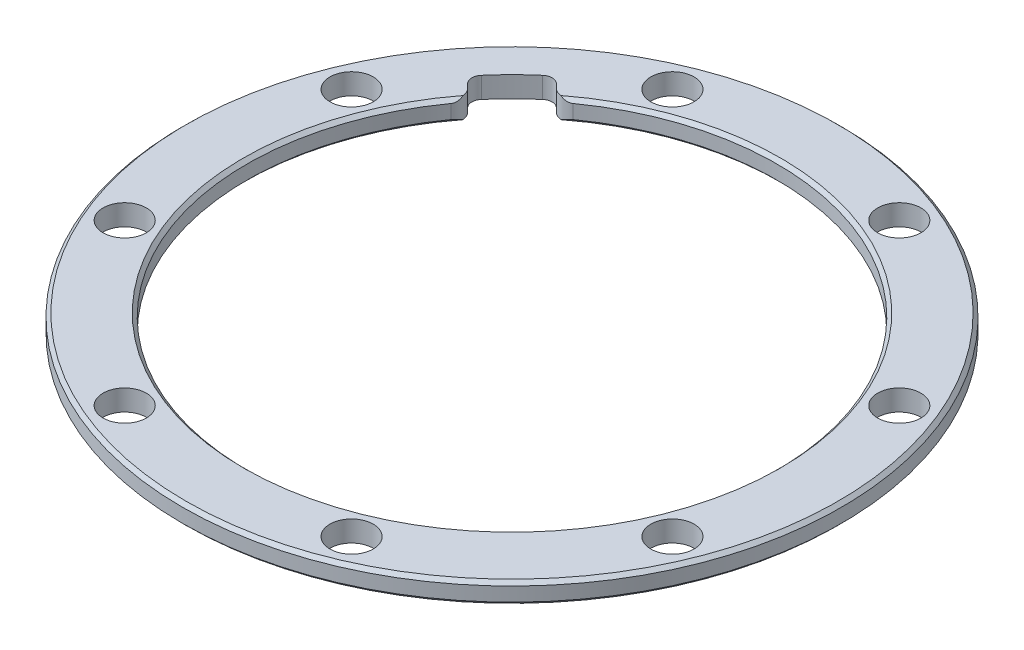
ISO-10303-21;
HEADER;
FILE_DESCRIPTION(('STEP AP214'),'2;1');
FILE_NAME('part.step','',(''),(''),'','','');
FILE_SCHEMA(('AUTOMOTIVE_DESIGN { 1 0 10303 214 1 1 1 1 }'));
ENDSEC;
DATA;
#1=APPLICATION_CONTEXT('core data for automotive mechanical design processes');
#2=APPLICATION_PROTOCOL_DEFINITION('international standard','automotive_design',2000,#1);
#3=PRODUCT_CONTEXT('',#1,'mechanical');
#4=PRODUCT('Part','Part','',(#3));
#5=PRODUCT_RELATED_PRODUCT_CATEGORY('part','',(#4));
#6=PRODUCT_DEFINITION_FORMATION('','',#4);
#7=PRODUCT_DEFINITION_CONTEXT('part definition',#1,'design');
#8=PRODUCT_DEFINITION('design','',#6,#7);
#9=PRODUCT_DEFINITION_SHAPE('','',#8);
#10=(LENGTH_UNIT() NAMED_UNIT(*) SI_UNIT(.MILLI.,.METRE.));
#11=(NAMED_UNIT(*) PLANE_ANGLE_UNIT() SI_UNIT($,.RADIAN.));
#12=(NAMED_UNIT(*) SI_UNIT($,.STERADIAN.) SOLID_ANGLE_UNIT());
#13=UNCERTAINTY_MEASURE_WITH_UNIT(LENGTH_MEASURE(1.E-05),#10,'distance_accuracy_value','');
#14=(GEOMETRIC_REPRESENTATION_CONTEXT(3) GLOBAL_UNCERTAINTY_ASSIGNED_CONTEXT((#13)) GLOBAL_UNIT_ASSIGNED_CONTEXT((#10,
#11,#12)) REPRESENTATION_CONTEXT('',''));
#15=CARTESIAN_POINT('',(0.,0.,0.));
#16=DIRECTION('',(0.,0.,1.));
#17=DIRECTION('',(1.,0.,0.));
#18=AXIS2_PLACEMENT_3D('',#15,#16,#17);
#19=CARTESIAN_POINT('',(0.,3.,0.));
#20=DIRECTION('',(0.,1.,0.));
#21=DIRECTION('',(0.,0.,1.));
#22=AXIS2_PLACEMENT_3D('',#19,#20,#21);
#23=PLANE('',#22);
#24=DIRECTION('',(0.70710364020529,0.,0.707109922153853));
#25=VECTOR('',#24,1.);
#26=CARTESIAN_POINT('',(-23.1447817429344,3.,-29.508976662052));
#27=LINE('',#26,#25);
#28=CARTESIAN_POINT('',(-25.2690481357726,3.,-31.6332619269925));
#29=VERTEX_POINT('',#28);
#30=CARTESIAN_POINT('',(-24.7262134702033,3.,-31.0904224388494));
#31=VERTEX_POINT('',#30);
#32=EDGE_CURVE('E127',#29,#31,#27,.T.);
#33=ORIENTED_EDGE('',*,*,#32,.T.);
#34=CARTESIAN_POINT('',(-23.3119936258956,3.,-32.50462971926));
#35=DIRECTION('',(0.,1.,0.));
#36=DIRECTION('',(0.,0.,1.));
#37=AXIS2_PLACEMENT_3D('',#34,#35,#36);
#38=CIRCLE('',#37,2.);
#39=CARTESIAN_POINT('',(-23.4795362384635,3.,-30.5116597061956));
#40=VERTEX_POINT('',#39);
#41=EDGE_CURVE('E242',#31,#40,#38,.T.);
#42=ORIENTED_EDGE('',*,*,#41,.T.);
#43=CARTESIAN_POINT('',(0.,3.,0.));
#44=DIRECTION('',(0.,1.,0.));
#45=DIRECTION('',(0.,0.,1.));
#46=AXIS2_PLACEMENT_3D('',#43,#44,#45);
#47=CIRCLE('',#46,38.5);
#48=CARTESIAN_POINT('',(-30.5116593053988,3.,-23.479536759299));
#49=VERTEX_POINT('',#48);
#50=EDGE_CURVE('E218',#40,#49,#47,.F.);
#51=ORIENTED_EDGE('',*,*,#50,.T.);
#52=CARTESIAN_POINT('',(-32.5046293213233,3.,-23.3119941807511));
#53=DIRECTION('',(0.,1.,0.));
#54=DIRECTION('',(0.,0.,1.));
#55=AXIS2_PLACEMENT_3D('',#52,#53,#54);
#56=CIRCLE('',#55,2.);
#57=CARTESIAN_POINT('',(-31.0904220167719,3.,-24.7262140009182));
#58=VERTEX_POINT('',#57);
#59=EDGE_CURVE('E125',#49,#58,#56,.T.);
#60=ORIENTED_EDGE('',*,*,#59,.T.);
#61=DIRECTION('',(-0.70710991008356,0.,-0.70710365227569));
#62=VECTOR('',#61,1.);
#63=CARTESIAN_POINT('',(-31.6332614956487,3.,-25.2690486757538));
#64=LINE('',#63,#62);
#65=CARTESIAN_POINT('',(-31.6332614956487,3.,-25.2690486757538));
#66=VERTEX_POINT('',#65);
#67=EDGE_CURVE('E116',#58,#66,#64,.T.);
#68=ORIENTED_EDGE('',*,*,#67,.T.);
#69=CARTESIAN_POINT('',(-30.5726060172352,3.,-26.3297135408791));
#70=DIRECTION('',(0.,-1.,0.));
#71=DIRECTION('',(0.,0.,1.));
#72=AXIS2_PLACEMENT_3D('',#69,#70,#71);
#73=CIRCLE('',#72,1.5);
#74=CARTESIAN_POINT('',(-31.709198504734,3.,-27.3085687484361));
#75=VERTEX_POINT('',#74);
#76=EDGE_CURVE('E122',#66,#75,#73,.T.);
#77=ORIENTED_EDGE('',*,*,#76,.T.);
#78=CARTESIAN_POINT('',(0.,3.,0.));
#79=DIRECTION('',(0.,-1.,0.));
#80=DIRECTION('',(0.,0.,-1.));
#81=AXIS2_PLACEMENT_3D('',#78,#79,#80);
#82=CIRCLE('',#81,41.8477143569477);
#83=CARTESIAN_POINT('',(-27.3085682071587,3.,-31.7091989708924));
#84=VERTEX_POINT('',#83);
#85=EDGE_CURVE('E142',#75,#84,#82,.T.);
#86=ORIENTED_EDGE('',*,*,#85,.T.);
#87=CARTESIAN_POINT('',(-26.3297130190034,3.,-30.5726064666845));
#88=DIRECTION('',(0.,-1.,0.));
#89=DIRECTION('',(0.,0.,-1.));
#90=AXIS2_PLACEMENT_3D('',#87,#88,#89);
#91=CIRCLE('',#90,1.5);
#92=EDGE_CURVE('E137',#84,#29,#91,.T.);
#93=ORIENTED_EDGE('',*,*,#92,.T.);
#94=EDGE_LOOP('',(#33,#42,#51,#60,#68,#77,#86,#93));
#95=FACE_BOUND('',#94,.T.);
#96=CARTESIAN_POINT('',(0.,3.,0.));
#97=DIRECTION('',(0.,1.,0.));
#98=DIRECTION('',(0.,0.,1.));
#99=AXIS2_PLACEMENT_3D('',#96,#97,#98);
#100=CIRCLE('',#99,46.75);
#101=CARTESIAN_POINT('',(0.,3.,46.75));
#102=VERTEX_POINT('',#101);
#103=EDGE_CURVE('E215',#102,#102,#100,.T.);
#104=ORIENTED_EDGE('',*,*,#103,.T.);
#105=EDGE_LOOP('',(#104));
#106=FACE_BOUND('',#105,.T.);
#107=CARTESIAN_POINT('',(-39.2648801317297,3.,16.2640458755163));
#108=DIRECTION('',(0.,1.,0.));
#109=DIRECTION('',(0.,0.,1.));
#110=AXIS2_PLACEMENT_3D('',#107,#108,#109);
#111=CIRCLE('',#110,3.1);
#112=CARTESIAN_POINT('',(-39.2648801317297,3.,19.3640458755163));
#113=VERTEX_POINT('',#112);
#114=EDGE_CURVE('E164',#113,#113,#111,.T.);
#115=ORIENTED_EDGE('',*,*,#114,.F.);
#116=EDGE_LOOP('',(#115));
#117=FACE_BOUND('',#116,.T.);
#118=CARTESIAN_POINT('',(16.2640458755163,3.,39.2648801317297));
#119=DIRECTION('',(0.,1.,0.));
#120=DIRECTION('',(0.,0.,1.));
#121=AXIS2_PLACEMENT_3D('',#118,#119,#120);
#122=CIRCLE('',#121,3.1);
#123=CARTESIAN_POINT('',(16.2640458755163,3.,42.3648801317297));
#124=VERTEX_POINT('',#123);
#125=EDGE_CURVE('E176',#124,#124,#122,.T.);
#126=ORIENTED_EDGE('',*,*,#125,.F.);
#127=EDGE_LOOP('',(#126));
#128=FACE_BOUND('',#127,.T.);
#129=CARTESIAN_POINT('',(39.2648801317297,3.,-16.2640458755163));
#130=DIRECTION('',(0.,1.,0.));
#131=DIRECTION('',(0.,0.,1.));
#132=AXIS2_PLACEMENT_3D('',#129,#130,#131);
#133=CIRCLE('',#132,3.1);
#134=CARTESIAN_POINT('',(39.2648801317297,3.,-13.1640458755163));
#135=VERTEX_POINT('',#134);
#136=EDGE_CURVE('E188',#135,#135,#133,.T.);
#137=ORIENTED_EDGE('',*,*,#136,.F.);
#138=EDGE_LOOP('',(#137));
#139=FACE_BOUND('',#138,.T.);
#140=CARTESIAN_POINT('',(16.2640458755163,3.,-39.2648801317297));
#141=DIRECTION('',(0.,1.,0.));
#142=DIRECTION('',(0.,0.,1.));
#143=AXIS2_PLACEMENT_3D('',#140,#141,#142);
#144=CIRCLE('',#143,3.1);
#145=CARTESIAN_POINT('',(16.2640458755163,3.,-36.1648801317297));
#146=VERTEX_POINT('',#145);
#147=EDGE_CURVE('E200',#146,#146,#144,.T.);
#148=ORIENTED_EDGE('',*,*,#147,.F.);
#149=EDGE_LOOP('',(#148));
#150=FACE_BOUND('',#149,.T.);
#151=CARTESIAN_POINT('',(-16.2640458755163,3.,-39.2648801317297));
#152=DIRECTION('',(0.,1.,0.));
#153=DIRECTION('',(0.,0.,1.));
#154=AXIS2_PLACEMENT_3D('',#151,#152,#153);
#155=CIRCLE('',#154,3.1);
#156=CARTESIAN_POINT('',(-16.2640458755163,3.,-36.1648801317297));
#157=VERTEX_POINT('',#156);
#158=EDGE_CURVE('E194',#157,#157,#155,.T.);
#159=ORIENTED_EDGE('',*,*,#158,.F.);
#160=EDGE_LOOP('',(#159));
#161=FACE_BOUND('',#160,.T.);
#162=CARTESIAN_POINT('',(39.2648801317297,3.,16.2640458755163));
#163=DIRECTION('',(0.,1.,0.));
#164=DIRECTION('',(0.,0.,1.));
#165=AXIS2_PLACEMENT_3D('',#162,#163,#164);
#166=CIRCLE('',#165,3.1);
#167=CARTESIAN_POINT('',(39.2648801317297,3.,19.3640458755163));
#168=VERTEX_POINT('',#167);
#169=EDGE_CURVE('E182',#168,#168,#166,.T.);
#170=ORIENTED_EDGE('',*,*,#169,.F.);
#171=EDGE_LOOP('',(#170));
#172=FACE_BOUND('',#171,.T.);
#173=CARTESIAN_POINT('',(-16.2640458755163,3.,39.2648801317297));
#174=DIRECTION('',(0.,1.,0.));
#175=DIRECTION('',(0.,0.,1.));
#176=AXIS2_PLACEMENT_3D('',#173,#174,#175);
#177=CIRCLE('',#176,3.1);
#178=CARTESIAN_POINT('',(-16.2640458755163,3.,42.3648801317297));
#179=VERTEX_POINT('',#178);
#180=EDGE_CURVE('E170',#179,#179,#177,.T.);
#181=ORIENTED_EDGE('',*,*,#180,.F.);
#182=EDGE_LOOP('',(#181));
#183=FACE_BOUND('',#182,.T.);
#184=CARTESIAN_POINT('',(-39.2648801317297,3.,-16.2640458755163));
#185=DIRECTION('',(0.,1.,0.));
#186=DIRECTION('',(0.,0.,1.));
#187=AXIS2_PLACEMENT_3D('',#184,#185,#186);
#188=CIRCLE('',#187,3.09999999999999);
#189=CARTESIAN_POINT('',(-39.2648801317297,3.,-13.1640458755163));
#190=VERTEX_POINT('',#189);
#191=EDGE_CURVE('E156',#190,#190,#188,.T.);
#192=ORIENTED_EDGE('',*,*,#191,.F.);
#193=EDGE_LOOP('',(#192));
#194=FACE_BOUND('',#193,.T.);
#195=ADVANCED_FACE('F36',(#95,#106,#117,#128,#139,#150,#161,#172,#183,#194),#23,.T.);
#196=CARTESIAN_POINT('',(0.,0.,0.));
#197=DIRECTION('',(0.,1.,0.));
#198=DIRECTION('',(0.,0.,1.));
#199=AXIS2_PLACEMENT_3D('',#196,#197,#198);
#200=PLANE('',#199);
#201=CARTESIAN_POINT('',(0.,0.,0.));
#202=DIRECTION('',(0.,1.,0.));
#203=DIRECTION('',(0.,0.,1.));
#204=AXIS2_PLACEMENT_3D('',#201,#202,#203);
#205=CIRCLE('',#204,38.5);
#206=CARTESIAN_POINT('',(-30.5116593053989,0.,-23.4795367592988));
#207=VERTEX_POINT('',#206);
#208=CARTESIAN_POINT('',(-23.4795362384636,0.,-30.5116597061955));
#209=VERTEX_POINT('',#208);
#210=EDGE_CURVE('E208',#207,#209,#205,.T.);
#211=ORIENTED_EDGE('',*,*,#210,.T.);
#212=CARTESIAN_POINT('',(-23.3119936258956,0.,-32.50462971926));
#213=DIRECTION('',(0.,1.,0.));
#214=DIRECTION('',(0.,0.,1.));
#215=AXIS2_PLACEMENT_3D('',#212,#213,#214);
#216=CIRCLE('',#215,2.);
#217=CARTESIAN_POINT('',(-24.7262134702033,0.,-31.0904224388494));
#218=VERTEX_POINT('',#217);
#219=EDGE_CURVE('E45',#209,#218,#216,.F.);
#220=ORIENTED_EDGE('',*,*,#219,.T.);
#221=DIRECTION('',(-0.70710364020529,0.,-0.707109922153853));
#222=VECTOR('',#221,1.);
#223=CARTESIAN_POINT('',(-23.1447817429344,0.,-29.508976662052));
#224=LINE('',#223,#222);
#225=CARTESIAN_POINT('',(-25.2690481357726,0.,-31.6332619269925));
#226=VERTEX_POINT('',#225);
#227=EDGE_CURVE('E163',#226,#218,#224,.F.);
#228=ORIENTED_EDGE('',*,*,#227,.F.);
#229=CARTESIAN_POINT('',(-26.3297130190034,0.,-30.5726064666845));
#230=DIRECTION('',(0.,1.,0.));
#231=DIRECTION('',(0.,0.,1.));
#232=AXIS2_PLACEMENT_3D('',#229,#230,#231);
#233=CIRCLE('',#232,1.5);
#234=CARTESIAN_POINT('',(-27.3085682071587,0.,-31.7091989708924));
#235=VERTEX_POINT('',#234);
#236=EDGE_CURVE('E232',#226,#235,#233,.T.);
#237=ORIENTED_EDGE('',*,*,#236,.T.);
#238=CARTESIAN_POINT('',(0.,0.,0.));
#239=DIRECTION('',(0.,1.,0.));
#240=DIRECTION('',(0.,0.,1.));
#241=AXIS2_PLACEMENT_3D('',#238,#239,#240);
#242=CIRCLE('',#241,41.8477143569477);
#243=CARTESIAN_POINT('',(-31.709198504734,0.,-27.3085687484361));
#244=VERTEX_POINT('',#243);
#245=EDGE_CURVE('E229',#235,#244,#242,.T.);
#246=ORIENTED_EDGE('',*,*,#245,.T.);
#247=CARTESIAN_POINT('',(-30.5726060172352,0.,-26.3297135408791));
#248=DIRECTION('',(0.,1.,0.));
#249=DIRECTION('',(0.,0.,1.));
#250=AXIS2_PLACEMENT_3D('',#247,#248,#249);
#251=CIRCLE('',#250,1.5);
#252=CARTESIAN_POINT('',(-31.6332614956487,0.,-25.2690486757538));
#253=VERTEX_POINT('',#252);
#254=EDGE_CURVE('E226',#244,#253,#251,.T.);
#255=ORIENTED_EDGE('',*,*,#254,.T.);
#256=DIRECTION('',(0.70710991008356,0.,0.70710365227569));
#257=VECTOR('',#256,1.);
#258=CARTESIAN_POINT('',(-31.6332614956487,0.,-25.2690486757538));
#259=LINE('',#258,#257);
#260=CARTESIAN_POINT('',(-31.0904220167719,0.,-24.7262140009182));
#261=VERTEX_POINT('',#260);
#262=EDGE_CURVE('E133',#261,#253,#259,.F.);
#263=ORIENTED_EDGE('',*,*,#262,.F.);
#264=CARTESIAN_POINT('',(-32.5046293213233,0.,-23.3119941807511));
#265=DIRECTION('',(0.,1.,0.));
#266=DIRECTION('',(0.,0.,1.));
#267=AXIS2_PLACEMENT_3D('',#264,#265,#266);
#268=CIRCLE('',#267,2.);
#269=EDGE_CURVE('E52',#261,#207,#268,.F.);
#270=ORIENTED_EDGE('',*,*,#269,.T.);
#271=EDGE_LOOP('',(#211,#220,#228,#237,#246,#255,#263,#270));
#272=FACE_BOUND('',#271,.T.);
#273=CARTESIAN_POINT('',(0.,0.,0.));
#274=DIRECTION('',(0.,1.,0.));
#275=DIRECTION('',(0.,0.,1.));
#276=AXIS2_PLACEMENT_3D('',#273,#274,#275);
#277=CIRCLE('',#276,46.75);
#278=CARTESIAN_POINT('',(0.,0.,46.75));
#279=VERTEX_POINT('',#278);
#280=EDGE_CURVE('E203',#279,#279,#277,.F.);
#281=ORIENTED_EDGE('',*,*,#280,.T.);
#282=EDGE_LOOP('',(#281));
#283=FACE_BOUND('',#282,.T.);
#284=CARTESIAN_POINT('',(16.2640458755163,0.,-39.2648801317297));
#285=DIRECTION('',(0.,1.,0.));
#286=DIRECTION('',(0.,0.,1.));
#287=AXIS2_PLACEMENT_3D('',#284,#285,#286);
#288=CIRCLE('',#287,3.1);
#289=CARTESIAN_POINT('',(16.2640458755163,0.,-36.1648801317297));
#290=VERTEX_POINT('',#289);
#291=EDGE_CURVE('E197',#290,#290,#288,.T.);
#292=ORIENTED_EDGE('',*,*,#291,.T.);
#293=EDGE_LOOP('',(#292));
#294=FACE_BOUND('',#293,.T.);
#295=CARTESIAN_POINT('',(-16.2640458755163,0.,-39.2648801317297));
#296=DIRECTION('',(0.,1.,0.));
#297=DIRECTION('',(0.,0.,1.));
#298=AXIS2_PLACEMENT_3D('',#295,#296,#297);
#299=CIRCLE('',#298,3.1);
#300=CARTESIAN_POINT('',(-16.2640458755163,0.,-36.1648801317297));
#301=VERTEX_POINT('',#300);
#302=EDGE_CURVE('E191',#301,#301,#299,.T.);
#303=ORIENTED_EDGE('',*,*,#302,.T.);
#304=EDGE_LOOP('',(#303));
#305=FACE_BOUND('',#304,.T.);
#306=CARTESIAN_POINT('',(39.2648801317297,0.,-16.2640458755163));
#307=DIRECTION('',(0.,1.,0.));
#308=DIRECTION('',(0.,0.,1.));
#309=AXIS2_PLACEMENT_3D('',#306,#307,#308);
#310=CIRCLE('',#309,3.1);
#311=CARTESIAN_POINT('',(39.2648801317297,0.,-13.1640458755163));
#312=VERTEX_POINT('',#311);
#313=EDGE_CURVE('E185',#312,#312,#310,.T.);
#314=ORIENTED_EDGE('',*,*,#313,.T.);
#315=EDGE_LOOP('',(#314));
#316=FACE_BOUND('',#315,.T.);
#317=CARTESIAN_POINT('',(39.2648801317297,0.,16.2640458755163));
#318=DIRECTION('',(0.,1.,0.));
#319=DIRECTION('',(0.,0.,1.));
#320=AXIS2_PLACEMENT_3D('',#317,#318,#319);
#321=CIRCLE('',#320,3.1);
#322=CARTESIAN_POINT('',(39.2648801317297,0.,19.3640458755163));
#323=VERTEX_POINT('',#322);
#324=EDGE_CURVE('E179',#323,#323,#321,.T.);
#325=ORIENTED_EDGE('',*,*,#324,.T.);
#326=EDGE_LOOP('',(#325));
#327=FACE_BOUND('',#326,.T.);
#328=CARTESIAN_POINT('',(16.2640458755163,0.,39.2648801317297));
#329=DIRECTION('',(0.,1.,0.));
#330=DIRECTION('',(0.,0.,1.));
#331=AXIS2_PLACEMENT_3D('',#328,#329,#330);
#332=CIRCLE('',#331,3.1);
#333=CARTESIAN_POINT('',(16.2640458755163,0.,42.3648801317297));
#334=VERTEX_POINT('',#333);
#335=EDGE_CURVE('E173',#334,#334,#332,.T.);
#336=ORIENTED_EDGE('',*,*,#335,.T.);
#337=EDGE_LOOP('',(#336));
#338=FACE_BOUND('',#337,.T.);
#339=CARTESIAN_POINT('',(-16.2640458755163,0.,39.2648801317297));
#340=DIRECTION('',(0.,1.,0.));
#341=DIRECTION('',(0.,0.,1.));
#342=AXIS2_PLACEMENT_3D('',#339,#340,#341);
#343=CIRCLE('',#342,3.1);
#344=CARTESIAN_POINT('',(-16.2640458755163,0.,42.3648801317297));
#345=VERTEX_POINT('',#344);
#346=EDGE_CURVE('E167',#345,#345,#343,.T.);
#347=ORIENTED_EDGE('',*,*,#346,.T.);
#348=EDGE_LOOP('',(#347));
#349=FACE_BOUND('',#348,.T.);
#350=CARTESIAN_POINT('',(-39.2648801317297,0.,16.2640458755163));
#351=DIRECTION('',(0.,1.,0.));
#352=DIRECTION('',(0.,0.,1.));
#353=AXIS2_PLACEMENT_3D('',#350,#351,#352);
#354=CIRCLE('',#353,3.1);
#355=CARTESIAN_POINT('',(-39.2648801317297,0.,19.3640458755163));
#356=VERTEX_POINT('',#355);
#357=EDGE_CURVE('E159',#356,#356,#354,.T.);
#358=ORIENTED_EDGE('',*,*,#357,.T.);
#359=EDGE_LOOP('',(#358));
#360=FACE_BOUND('',#359,.T.);
#361=CARTESIAN_POINT('',(-39.2648801317297,0.,-16.2640458755163));
#362=DIRECTION('',(0.,1.,0.));
#363=DIRECTION('',(0.,0.,1.));
#364=AXIS2_PLACEMENT_3D('',#361,#362,#363);
#365=CIRCLE('',#364,3.09999999999999);
#366=CARTESIAN_POINT('',(-39.2648801317297,0.,-13.1640458755163));
#367=VERTEX_POINT('',#366);
#368=EDGE_CURVE('E160',#367,#367,#365,.T.);
#369=ORIENTED_EDGE('',*,*,#368,.T.);
#370=EDGE_LOOP('',(#369));
#371=FACE_BOUND('',#370,.T.);
#372=ADVANCED_FACE('F306',(#272,#283,#294,#305,#316,#327,#338,#349,#360,#371),#200,.F.);
#373=CARTESIAN_POINT('',(0.,3.,0.));
#374=DIRECTION('',(0.,-1.,0.));
#375=DIRECTION('',(0.,0.,-1.));
#376=AXIS2_PLACEMENT_3D('',#373,#374,#375);
#377=CYLINDRICAL_SURFACE('',#376,47.25);
#378=CARTESIAN_POINT('',(0.,0.499999999999994,0.));
#379=DIRECTION('',(0.,1.,0.));
#380=DIRECTION('',(0.,0.,1.));
#381=AXIS2_PLACEMENT_3D('',#378,#379,#380);
#382=CIRCLE('',#381,47.25);
#383=CARTESIAN_POINT('',(0.,0.499999999999994,47.25));
#384=VERTEX_POINT('',#383);
#385=EDGE_CURVE('E223',#384,#384,#382,.T.);
#386=ORIENTED_EDGE('',*,*,#385,.T.);
#387=EDGE_LOOP('',(#386));
#388=FACE_BOUND('',#387,.T.);
#389=CARTESIAN_POINT('',(0.,2.49999999999999,0.));
#390=DIRECTION('',(0.,1.,0.));
#391=DIRECTION('',(0.,0.,1.));
#392=AXIS2_PLACEMENT_3D('',#389,#390,#391);
#393=CIRCLE('',#392,47.25);
#394=CARTESIAN_POINT('',(0.,2.49999999999999,47.25));
#395=VERTEX_POINT('',#394);
#396=EDGE_CURVE('E220',#395,#395,#393,.F.);
#397=ORIENTED_EDGE('',*,*,#396,.T.);
#398=EDGE_LOOP('',(#397));
#399=FACE_BOUND('',#398,.T.);
#400=ADVANCED_FACE('F334',(#388,#399),#377,.T.);
#401=CARTESIAN_POINT('',(0.,3.,0.));
#402=DIRECTION('',(0.,-1.,0.));
#403=DIRECTION('',(0.,0.,-1.));
#404=AXIS2_PLACEMENT_3D('',#401,#402,#403);
#405=CYLINDRICAL_SURFACE('',#404,38.);
#406=CARTESIAN_POINT('',(0.,2.49999999999999,0.));
#407=DIRECTION('',(0.,1.,0.));
#408=DIRECTION('',(0.,0.,1.));
#409=AXIS2_PLACEMENT_3D('',#406,#407,#408);
#410=CIRCLE('',#409,38.);
#411=CARTESIAN_POINT('',(-30.8793978552571,2.49999999999999,-22.1463944717135));
#412=VERTEX_POINT('',#411);
#413=CARTESIAN_POINT('',(-22.1463939446009,2.49999999999999,-30.879398233297));
#414=VERTEX_POINT('',#413);
#415=EDGE_CURVE('E209',#412,#414,#410,.T.);
#416=ORIENTED_EDGE('',*,*,#415,.T.);
#417=DIRECTION('',(0.,-1.,0.));
#418=VECTOR('',#417,1.);
#419=CARTESIAN_POINT('',(-22.1463939446009,3.,-30.879398233297));
#420=LINE('',#419,#418);
#421=CARTESIAN_POINT('',(-22.1463939446009,0.499999999999987,-30.879398233297));
#422=VERTEX_POINT('',#421);
#423=EDGE_CURVE('E561',#414,#422,#420,.T.);
#424=ORIENTED_EDGE('',*,*,#423,.T.);
#425=CARTESIAN_POINT('',(0.,0.499999999999987,0.));
#426=DIRECTION('',(0.,1.,0.));
#427=DIRECTION('',(0.,0.,1.));
#428=AXIS2_PLACEMENT_3D('',#425,#426,#427);
#429=CIRCLE('',#428,38.);
#430=CARTESIAN_POINT('',(-30.8793978552571,0.499999999999987,-22.1463944717135));
#431=VERTEX_POINT('',#430);
#432=EDGE_CURVE('E212',#422,#431,#429,.F.);
#433=ORIENTED_EDGE('',*,*,#432,.T.);
#434=DIRECTION('',(0.,-1.,0.));
#435=VECTOR('',#434,1.);
#436=CARTESIAN_POINT('',(-30.8793978552571,3.,-22.1463944717135));
#437=LINE('',#436,#435);
#438=EDGE_CURVE('E318',#431,#412,#437,.F.);
#439=ORIENTED_EDGE('',*,*,#438,.T.);
#440=EDGE_LOOP('',(#416,#424,#433,#439));
#441=FACE_BOUND('',#440,.T.);
#442=ADVANCED_FACE('F337',(#441),#405,.F.);
#443=CARTESIAN_POINT('',(16.2640458755163,3.,-39.2648801317297));
#444=DIRECTION('',(0.,-1.,0.));
#445=DIRECTION('',(0.,0.,-1.));
#446=AXIS2_PLACEMENT_3D('',#443,#444,#445);
#447=CYLINDRICAL_SURFACE('',#446,3.1);
#448=ORIENTED_EDGE('',*,*,#147,.T.);
#449=EDGE_LOOP('',(#448));
#450=FACE_BOUND('',#449,.T.);
#451=ORIENTED_EDGE('',*,*,#291,.F.);
#452=EDGE_LOOP('',(#451));
#453=FACE_BOUND('',#452,.T.);
#454=ADVANCED_FACE('F344',(#450,#453),#447,.F.);
#455=CARTESIAN_POINT('',(-16.2640458755163,3.,-39.2648801317297));
#456=DIRECTION('',(0.,-1.,0.));
#457=DIRECTION('',(0.,0.,-1.));
#458=AXIS2_PLACEMENT_3D('',#455,#456,#457);
#459=CYLINDRICAL_SURFACE('',#458,3.1);
#460=ORIENTED_EDGE('',*,*,#158,.T.);
#461=EDGE_LOOP('',(#460));
#462=FACE_BOUND('',#461,.T.);
#463=ORIENTED_EDGE('',*,*,#302,.F.);
#464=EDGE_LOOP('',(#463));
#465=FACE_BOUND('',#464,.T.);
#466=ADVANCED_FACE('F399',(#462,#465),#459,.F.);
#467=CARTESIAN_POINT('',(39.2648801317297,3.,-16.2640458755163));
#468=DIRECTION('',(0.,-1.,0.));
#469=DIRECTION('',(0.,0.,-1.));
#470=AXIS2_PLACEMENT_3D('',#467,#468,#469);
#471=CYLINDRICAL_SURFACE('',#470,3.1);
#472=ORIENTED_EDGE('',*,*,#136,.T.);
#473=EDGE_LOOP('',(#472));
#474=FACE_BOUND('',#473,.T.);
#475=ORIENTED_EDGE('',*,*,#313,.F.);
#476=EDGE_LOOP('',(#475));
#477=FACE_BOUND('',#476,.T.);
#478=ADVANCED_FACE('F395',(#474,#477),#471,.F.);
#479=CARTESIAN_POINT('',(39.2648801317297,3.,16.2640458755163));
#480=DIRECTION('',(0.,-1.,0.));
#481=DIRECTION('',(0.,0.,-1.));
#482=AXIS2_PLACEMENT_3D('',#479,#480,#481);
#483=CYLINDRICAL_SURFACE('',#482,3.1);
#484=ORIENTED_EDGE('',*,*,#169,.T.);
#485=EDGE_LOOP('',(#484));
#486=FACE_BOUND('',#485,.T.);
#487=ORIENTED_EDGE('',*,*,#324,.F.);
#488=EDGE_LOOP('',(#487));
#489=FACE_BOUND('',#488,.T.);
#490=ADVANCED_FACE('F391',(#486,#489),#483,.F.);
#491=CARTESIAN_POINT('',(16.2640458755163,3.,39.2648801317297));
#492=DIRECTION('',(0.,-1.,0.));
#493=DIRECTION('',(0.,0.,-1.));
#494=AXIS2_PLACEMENT_3D('',#491,#492,#493);
#495=CYLINDRICAL_SURFACE('',#494,3.1);
#496=ORIENTED_EDGE('',*,*,#125,.T.);
#497=EDGE_LOOP('',(#496));
#498=FACE_BOUND('',#497,.T.);
#499=ORIENTED_EDGE('',*,*,#335,.F.);
#500=EDGE_LOOP('',(#499));
#501=FACE_BOUND('',#500,.T.);
#502=ADVANCED_FACE('F387',(#498,#501),#495,.F.);
#503=CARTESIAN_POINT('',(-16.2640458755163,3.,39.2648801317297));
#504=DIRECTION('',(0.,-1.,0.));
#505=DIRECTION('',(0.,0.,-1.));
#506=AXIS2_PLACEMENT_3D('',#503,#504,#505);
#507=CYLINDRICAL_SURFACE('',#506,3.1);
#508=ORIENTED_EDGE('',*,*,#180,.T.);
#509=EDGE_LOOP('',(#508));
#510=FACE_BOUND('',#509,.T.);
#511=ORIENTED_EDGE('',*,*,#346,.F.);
#512=EDGE_LOOP('',(#511));
#513=FACE_BOUND('',#512,.T.);
#514=ADVANCED_FACE('F379',(#510,#513),#507,.F.);
#515=CARTESIAN_POINT('',(-39.2648801317297,3.,16.2640458755163));
#516=DIRECTION('',(0.,-1.,0.));
#517=DIRECTION('',(0.,0.,-1.));
#518=AXIS2_PLACEMENT_3D('',#515,#516,#517);
#519=CYLINDRICAL_SURFACE('',#518,3.1);
#520=ORIENTED_EDGE('',*,*,#114,.T.);
#521=EDGE_LOOP('',(#520));
#522=FACE_BOUND('',#521,.T.);
#523=ORIENTED_EDGE('',*,*,#357,.F.);
#524=EDGE_LOOP('',(#523));
#525=FACE_BOUND('',#524,.T.);
#526=ADVANCED_FACE('F371',(#522,#525),#519,.F.);
#527=CARTESIAN_POINT('',(-39.2648801317297,3.,-16.2640458755163));
#528=DIRECTION('',(0.,-1.,0.));
#529=DIRECTION('',(0.,0.,-1.));
#530=AXIS2_PLACEMENT_3D('',#527,#528,#529);
#531=CYLINDRICAL_SURFACE('',#530,3.09999999999999);
#532=ORIENTED_EDGE('',*,*,#191,.T.);
#533=EDGE_LOOP('',(#532));
#534=FACE_BOUND('',#533,.T.);
#535=ORIENTED_EDGE('',*,*,#368,.F.);
#536=EDGE_LOOP('',(#535));
#537=FACE_BOUND('',#536,.T.);
#538=ADVANCED_FACE('F368',(#534,#537),#531,.F.);
#539=CARTESIAN_POINT('',(0.,0.,0.));
#540=DIRECTION('',(0.,-1.,0.));
#541=DIRECTION('',(0.,0.,-1.));
#542=AXIS2_PLACEMENT_3D('',#539,#540,#541);
#543=CONICAL_SURFACE('',#542,38.5,0.785398163397455);
#544=ORIENTED_EDGE('',*,*,#432,.F.);
#545=CARTESIAN_POINT('',(-22.1463939446009,0.499999999999987,-30.879398233297));
#546=CARTESIAN_POINT('',(-22.1824247475522,0.500012619852869,-30.8535429998844));
#547=CARTESIAN_POINT('',(-22.2193208772159,0.49844778746894,-30.8289104152971));
#548=CARTESIAN_POINT('',(-22.2944451008427,0.492260295917155,-30.7822662992595));
#549=CARTESIAN_POINT('',(-22.3326720153435,0.487640282296606,-30.7602525195712));
#550=CARTESIAN_POINT('',(-22.4096836251549,0.475508368907494,-30.7192105140432));
#551=CARTESIAN_POINT('',(-22.4484570818461,0.468029852134272,-30.7001512671353));
#552=CARTESIAN_POINT('',(-22.526624310022,0.450349208957683,-30.6647825182742));
#553=CARTESIAN_POINT('',(-22.5660181710326,0.440146686021237,-30.6484734172236));
#554=CARTESIAN_POINT('',(-22.684368624847,0.40582159285926,-30.6037971913555));
#555=CARTESIAN_POINT('',(-22.7638187134193,0.377928085601308,-30.5795106860551));
#556=CARTESIAN_POINT('',(-22.9221318437984,0.313758270275538,-30.5412930820634));
#557=CARTESIAN_POINT('',(-23.000990387648,0.277443278004009,-30.5274110615233));
#558=CARTESIAN_POINT('',(-23.147951550767,0.202569685424862,-30.5101480752713));
#559=CARTESIAN_POINT('',(-23.2162921790968,0.164683085952955,-30.5057903839503));
#560=CARTESIAN_POINT('',(-23.350066218071,0.0850327327160408,-30.5038841625648));
#561=CARTESIAN_POINT('',(-23.4155182514006,0.0433017793902333,-30.5062824037319));
#562=CARTESIAN_POINT('',(-23.4795362384635,0.,-30.5116597061956));
#563=B_SPLINE_CURVE_WITH_KNOTS('',3,(#545,#546,#547,#548,#549,#550,#551,#552,#553,#554,#555,
#556,#557,#558,#559,#560,#561,#562),.UNSPECIFIED.,.F.,.F.,(4,2,2,2,2,2,2,2,4),(0.,
0.132975202063296,0.265835408544915,0.397189206709561,0.528562136457737,0.790211566934968,
1.05308756672913,1.28741400211991,1.51989939729887),.UNSPECIFIED.);
#564=EDGE_CURVE('E59',#422,#209,#563,.T.);
#565=ORIENTED_EDGE('',*,*,#564,.T.);
#566=ORIENTED_EDGE('',*,*,#210,.F.);
#567=CARTESIAN_POINT('',(-30.5116593053989,0.,-23.4795367592988));
#568=CARTESIAN_POINT('',(-30.5043091892198,0.0590143435728234,-23.3923139260308));
#569=CARTESIAN_POINT('',(-30.5025253983304,0.11523546891775,-23.3021845377265));
#570=CARTESIAN_POINT('',(-30.5119812829277,0.219858724962047,-23.1169683973619));
#571=CARTESIAN_POINT('',(-30.5233574415487,0.268172874682297,-23.0218396377775));
#572=CARTESIAN_POINT('',(-30.5579265150936,0.345907259316552,-22.8462948293874));
#573=CARTESIAN_POINT('',(-30.5786912030838,0.377155774661335,-22.7662314174391));
#574=CARTESIAN_POINT('',(-30.6311696332892,0.429862116873508,-22.6069265005078));
#575=CARTESIAN_POINT('',(-30.6628159362932,0.451378401137643,-22.5276829593656));
#576=CARTESIAN_POINT('',(-30.7249628883059,0.478011469227307,-22.3975783550781));
#577=CARTESIAN_POINT('',(-30.7524681111652,0.486188512857377,-22.3458930650472));
#578=CARTESIAN_POINT('',(-30.8123520916033,0.497215236868772,-22.2444177617335));
#579=CARTESIAN_POINT('',(-30.8447587780566,0.500033043174392,-22.194640802761));
#580=CARTESIAN_POINT('',(-30.8793978552571,0.499999999999986,-22.1463944717135));
#581=B_SPLINE_CURVE_WITH_KNOTS('',3,(#567,#568,#569,#570,#571,#572,#573,#574,#575,#576,#577,
#578,#579,#580),.UNSPECIFIED.,.F.,.F.,(4,2,2,2,2,2,4),(0.,0.317205011505007,0.637729505567147,
0.901920917637148,1.16450365522571,1.34140809974373,1.5193614332507),.UNSPECIFIED.);
#582=EDGE_CURVE('E297',#207,#431,#581,.T.);
#583=ORIENTED_EDGE('',*,*,#582,.T.);
#584=EDGE_LOOP('',(#544,#565,#566,#583));
#585=FACE_BOUND('',#584,.T.);
#586=ADVANCED_FACE('F268',(#585),#543,.F.);
#587=CARTESIAN_POINT('',(0.,2.49999999999999,0.));
#588=DIRECTION('',(0.,1.,0.));
#589=DIRECTION('',(0.,0.,1.));
#590=AXIS2_PLACEMENT_3D('',#587,#588,#589);
#591=CONICAL_SURFACE('',#590,38.,0.785398163397469);
#592=ORIENTED_EDGE('',*,*,#50,.F.);
#593=CARTESIAN_POINT('',(-23.4795362384635,3.,-30.5116597061956));
#594=CARTESIAN_POINT('',(-23.392313405321,2.94098565642717,-30.5043095885276));
#595=CARTESIAN_POINT('',(-23.3021840170471,2.88476453108224,-30.5025257960997));
#596=CARTESIAN_POINT('',(-23.1169678765211,2.78014127503794,-30.5119816775353));
#597=CARTESIAN_POINT('',(-23.0218391167425,2.7318271253177,-30.5233578345325));
#598=CARTESIAN_POINT('',(-22.8462943077624,2.65409274068344,-30.5579269050808));
#599=CARTESIAN_POINT('',(-22.7662308954595,2.62284422533865,-30.5786915917043));
#600=CARTESIAN_POINT('',(-22.6069259776324,2.57013788312647,-30.6311700191904));
#601=CARTESIAN_POINT('',(-22.5276824359501,2.54862159886233,-30.6628163208417));
#602=CARTESIAN_POINT('',(-22.3975778306016,2.52198853077266,-30.7249632706335));
#603=CARTESIAN_POINT('',(-22.3458925401013,2.51381148714259,-30.7524684926105));
#604=CARTESIAN_POINT('',(-22.2444172357653,2.5027847631312,-30.8123524713165));
#605=CARTESIAN_POINT('',(-22.1946402762397,2.49996695682558,-30.8447591569201));
#606=CARTESIAN_POINT('',(-22.1463939446009,2.49999999999998,-30.879398233297));
#607=B_SPLINE_CURVE_WITH_KNOTS('',3,(#593,#594,#595,#596,#597,#598,#599,#600,#601,#602,#603,
#604,#605,#606),.UNSPECIFIED.,.F.,.F.,(4,2,2,2,2,2,4),(0.,0.317205011505011,0.637729505567163,
0.901920917637171,1.16450365522575,1.34140809974378,1.51936143325078),.UNSPECIFIED.);
#608=EDGE_CURVE('E251',#40,#414,#607,.T.);
#609=ORIENTED_EDGE('',*,*,#608,.T.);
#610=ORIENTED_EDGE('',*,*,#415,.F.);
#611=CARTESIAN_POINT('',(-30.8793978552571,2.49999999999999,-22.1463944717135));
#612=CARTESIAN_POINT('',(-30.8535426212295,2.4999873801471,-22.1824252742235));
#613=CARTESIAN_POINT('',(-30.8289100360123,2.50155221253103,-22.2193214034668));
#614=CARTESIAN_POINT('',(-30.7822659186923,2.50773970408282,-22.2944456262973));
#615=CARTESIAN_POINT('',(-30.7602521383515,2.51235971770337,-22.3326725404224));
#616=CARTESIAN_POINT('',(-30.7192101315089,2.52449163109248,-22.4096841495332));
#617=CARTESIAN_POINT('',(-30.7001508839392,2.5319701478657,-22.448457605899));
#618=CARTESIAN_POINT('',(-30.6647821337438,2.54965079104229,-22.5266248334712));
#619=CARTESIAN_POINT('',(-30.6484730320207,2.55985331397874,-22.5660186942034));
#620=CARTESIAN_POINT('',(-30.6037968041323,2.59417840714071,-22.6843691472551));
#621=CARTESIAN_POINT('',(-30.5795102974757,2.62207191439866,-22.7638192354129));
#622=CARTESIAN_POINT('',(-30.5412926907816,2.68624172972443,-22.9221323651396));
#623=CARTESIAN_POINT('',(-30.5274106688954,2.72255672199596,-23.0009909087522));
#624=CARTESIAN_POINT('',(-30.5101476801348,2.79743031457511,-23.1479520715765));
#625=CARTESIAN_POINT('',(-30.5057899876472,2.83531691404702,-23.216292699832));
#626=CARTESIAN_POINT('',(-30.5038837639782,2.91496726728395,-23.3500667387737));
#627=CARTESIAN_POINT('',(-30.506282004028,2.95669822060976,-23.4155187721442));
#628=CARTESIAN_POINT('',(-30.5116593053989,3.,-23.4795367592989));
#629=B_SPLINE_CURVE_WITH_KNOTS('',3,(#611,#612,#613,#614,#615,#616,#617,#618,#619,#620,#621,
#622,#623,#624,#625,#626,#627,#628),.UNSPECIFIED.,.F.,.F.,(4,2,2,2,2,2,2,2,4),(0.,
0.132975202063301,0.265835408544918,0.397189206709561,0.528562136457741,0.790211566934978,
1.05308756672914,1.28741400211994,1.51989939729893),.UNSPECIFIED.);
#630=EDGE_CURVE('E244',#412,#49,#629,.T.);
#631=ORIENTED_EDGE('',*,*,#630,.T.);
#632=EDGE_LOOP('',(#592,#609,#610,#631));
#633=FACE_BOUND('',#632,.T.);
#634=ADVANCED_FACE('F258',(#633),#591,.F.);
#635=CARTESIAN_POINT('',(0.,0.499999999999994,0.));
#636=DIRECTION('',(0.,1.,0.));
#637=DIRECTION('',(0.,0.,1.));
#638=AXIS2_PLACEMENT_3D('',#635,#636,#637);
#639=CONICAL_SURFACE('',#638,47.25,0.785398163397455);
#640=ORIENTED_EDGE('',*,*,#280,.F.);
#641=EDGE_LOOP('',(#640));
#642=FACE_BOUND('',#641,.T.);
#643=ORIENTED_EDGE('',*,*,#385,.F.);
#644=EDGE_LOOP('',(#643));
#645=FACE_BOUND('',#644,.T.);
#646=ADVANCED_FACE('F267',(#642,#645),#639,.T.);
#647=CARTESIAN_POINT('',(0.,3.,0.));
#648=DIRECTION('',(0.,-1.,0.));
#649=DIRECTION('',(0.,0.,-1.));
#650=AXIS2_PLACEMENT_3D('',#647,#648,#649);
#651=CONICAL_SURFACE('',#650,46.75,0.785398163397441);
#652=ORIENTED_EDGE('',*,*,#396,.F.);
#653=EDGE_LOOP('',(#652));
#654=FACE_BOUND('',#653,.T.);
#655=ORIENTED_EDGE('',*,*,#103,.F.);
#656=EDGE_LOOP('',(#655));
#657=FACE_BOUND('',#656,.T.);
#658=ADVANCED_FACE('F278',(#654,#657),#651,.T.);
#659=CARTESIAN_POINT('',(-26.3297130190034,3.,-30.5726064666845));
#660=DIRECTION('',(0.,-1.,0.));
#661=DIRECTION('',(0.,0.,-1.));
#662=AXIS2_PLACEMENT_3D('',#659,#660,#661);
#663=CYLINDRICAL_SURFACE('',#662,1.5);
#664=DIRECTION('',(0.,-1.,0.));
#665=VECTOR('',#664,1.);
#666=CARTESIAN_POINT('',(-25.2690481357726,3.,-31.6332619269925));
#667=LINE('',#666,#665);
#668=EDGE_CURVE('E152',#29,#226,#667,.T.);
#669=ORIENTED_EDGE('',*,*,#668,.F.);
#670=ORIENTED_EDGE('',*,*,#92,.F.);
#671=DIRECTION('',(0.,-1.,0.));
#672=VECTOR('',#671,1.);
#673=CARTESIAN_POINT('',(-27.3085682071587,3.,-31.7091989708924));
#674=LINE('',#673,#672);
#675=EDGE_CURVE('E149',#84,#235,#674,.T.);
#676=ORIENTED_EDGE('',*,*,#675,.T.);
#677=ORIENTED_EDGE('',*,*,#236,.F.);
#678=EDGE_LOOP('',(#669,#670,#676,#677));
#679=FACE_BOUND('',#678,.T.);
#680=ADVANCED_FACE('F283',(#679),#663,.F.);
#681=CARTESIAN_POINT('',(0.,3.,0.));
#682=DIRECTION('',(0.,-1.,0.));
#683=DIRECTION('',(0.,0.,-1.));
#684=AXIS2_PLACEMENT_3D('',#681,#682,#683);
#685=CYLINDRICAL_SURFACE('',#684,41.8477143569477);
#686=ORIENTED_EDGE('',*,*,#675,.F.);
#687=ORIENTED_EDGE('',*,*,#85,.F.);
#688=DIRECTION('',(0.,-1.,0.));
#689=VECTOR('',#688,1.);
#690=CARTESIAN_POINT('',(-31.709198504734,3.,-27.3085687484361));
#691=LINE('',#690,#689);
#692=EDGE_CURVE('E136',#75,#244,#691,.T.);
#693=ORIENTED_EDGE('',*,*,#692,.T.);
#694=ORIENTED_EDGE('',*,*,#245,.F.);
#695=EDGE_LOOP('',(#686,#687,#693,#694));
#696=FACE_BOUND('',#695,.T.);
#697=ADVANCED_FACE('F320',(#696),#685,.F.);
#698=CARTESIAN_POINT('',(-30.5726060172352,3.,-26.3297135408791));
#699=DIRECTION('',(0.,-1.,0.));
#700=DIRECTION('',(0.,0.,-1.));
#701=AXIS2_PLACEMENT_3D('',#698,#699,#700);
#702=CYLINDRICAL_SURFACE('',#701,1.5);
#703=ORIENTED_EDGE('',*,*,#692,.F.);
#704=ORIENTED_EDGE('',*,*,#76,.F.);
#705=DIRECTION('',(0.,-1.,0.));
#706=VECTOR('',#705,1.);
#707=CARTESIAN_POINT('',(-31.6332614956487,3.,-25.2690486757538));
#708=LINE('',#707,#706);
#709=EDGE_CURVE('E130',#66,#253,#708,.T.);
#710=ORIENTED_EDGE('',*,*,#709,.T.);
#711=ORIENTED_EDGE('',*,*,#254,.F.);
#712=EDGE_LOOP('',(#703,#704,#710,#711));
#713=FACE_BOUND('',#712,.T.);
#714=ADVANCED_FACE('F139',(#713),#702,.F.);
#715=CARTESIAN_POINT('',(-23.1447817429344,3.,-29.508976662052));
#716=DIRECTION('',(0.707109922153853,0.,-0.70710364020529));
#717=DIRECTION('',(-0.70710364020529,0.,-0.707109922153853));
#718=AXIS2_PLACEMENT_3D('',#715,#716,#717);
#719=PLANE('',#718);
#720=ORIENTED_EDGE('',*,*,#227,.T.);
#721=DIRECTION('',(0.,1.,0.));
#722=VECTOR('',#721,1.);
#723=CARTESIAN_POINT('',(-24.7262134702033,2.49999999999998,-31.0904224388494));
#724=LINE('',#723,#722);
#725=EDGE_CURVE('E235',#218,#31,#724,.T.);
#726=ORIENTED_EDGE('',*,*,#725,.T.);
#727=ORIENTED_EDGE('',*,*,#32,.F.);
#728=ORIENTED_EDGE('',*,*,#668,.T.);
#729=EDGE_LOOP('',(#720,#726,#727,#728));
#730=FACE_BOUND('',#729,.T.);
#731=ADVANCED_FACE('F310',(#730),#719,.F.);
#732=CARTESIAN_POINT('',(-31.6332614956487,3.,-25.2690486757538));
#733=DIRECTION('',(-0.70710365227569,0.,0.70710991008356));
#734=DIRECTION('',(0.70710991008356,0.,0.70710365227569));
#735=AXIS2_PLACEMENT_3D('',#732,#733,#734);
#736=PLANE('',#735);
#737=ORIENTED_EDGE('',*,*,#67,.F.);
#738=DIRECTION('',(0.,1.,0.));
#739=VECTOR('',#738,1.);
#740=CARTESIAN_POINT('',(-31.0904220167719,0.499999999999987,-24.7262140009182));
#741=LINE('',#740,#739);
#742=EDGE_CURVE('E11',#58,#261,#741,.F.);
#743=ORIENTED_EDGE('',*,*,#742,.T.);
#744=ORIENTED_EDGE('',*,*,#262,.T.);
#745=ORIENTED_EDGE('',*,*,#709,.F.);
#746=EDGE_LOOP('',(#737,#743,#744,#745));
#747=FACE_BOUND('',#746,.T.);
#748=ADVANCED_FACE('F131',(#747),#736,.F.);
#749=CARTESIAN_POINT('',(-23.3119936258956,3.,-32.50462971926));
#750=DIRECTION('',(0.,-1.,0.));
#751=DIRECTION('',(0.,0.,-1.));
#752=AXIS2_PLACEMENT_3D('',#749,#750,#751);
#753=CYLINDRICAL_SURFACE('',#752,2.);
#754=ORIENTED_EDGE('',*,*,#564,.F.);
#755=ORIENTED_EDGE('',*,*,#423,.F.);
#756=ORIENTED_EDGE('',*,*,#608,.F.);
#757=ORIENTED_EDGE('',*,*,#41,.F.);
#758=ORIENTED_EDGE('',*,*,#725,.F.);
#759=ORIENTED_EDGE('',*,*,#219,.F.);
#760=EDGE_LOOP('',(#754,#755,#756,#757,#758,#759));
#761=FACE_BOUND('',#760,.T.);
#762=ADVANCED_FACE('F285',(#761),#753,.T.);
#763=CARTESIAN_POINT('',(-32.5046293213233,3.,-23.3119941807511));
#764=DIRECTION('',(0.,-1.,0.));
#765=DIRECTION('',(0.,0.,-1.));
#766=AXIS2_PLACEMENT_3D('',#763,#764,#765);
#767=CYLINDRICAL_SURFACE('',#766,2.);
#768=ORIENTED_EDGE('',*,*,#630,.F.);
#769=ORIENTED_EDGE('',*,*,#438,.F.);
#770=ORIENTED_EDGE('',*,*,#582,.F.);
#771=ORIENTED_EDGE('',*,*,#269,.F.);
#772=ORIENTED_EDGE('',*,*,#742,.F.);
#773=ORIENTED_EDGE('',*,*,#59,.F.);
#774=EDGE_LOOP('',(#768,#769,#770,#771,#772,#773));
#775=FACE_BOUND('',#774,.T.);
#776=ADVANCED_FACE('F38',(#775),#767,.T.);
#777=CLOSED_SHELL('',(#195,#372,#400,#442,#454,#466,#478,#490,#502,#514,#526,#538,#586,#634,
#646,#658,#680,#697,#714,#731,#748,#762,#776));
#778=MANIFOLD_SOLID_BREP('B2',#777);
#779=ADVANCED_BREP_SHAPE_REPRESENTATION('',(#18,#778),#14);
#780=SHAPE_DEFINITION_REPRESENTATION(#9,#779);
ENDSEC;
END-ISO-10303-21;
